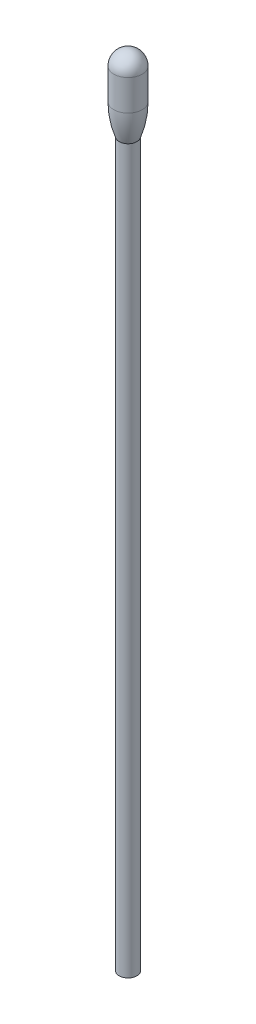
ISO-10303-21;
HEADER;
FILE_DESCRIPTION(('STEP AP214'),'2;1');
FILE_NAME('part.step','',(''),(''),'','','');
FILE_SCHEMA(('AUTOMOTIVE_DESIGN { 1 0 10303 214 1 1 1 1 }'));
ENDSEC;
DATA;
#1=APPLICATION_CONTEXT('core data for automotive mechanical design processes');
#2=APPLICATION_PROTOCOL_DEFINITION('international standard','automotive_design',2000,#1);
#3=PRODUCT_CONTEXT('',#1,'mechanical');
#4=PRODUCT('Part','Part','',(#3));
#5=PRODUCT_RELATED_PRODUCT_CATEGORY('part','',(#4));
#6=PRODUCT_DEFINITION_FORMATION('','',#4);
#7=PRODUCT_DEFINITION_CONTEXT('part definition',#1,'design');
#8=PRODUCT_DEFINITION('design','',#6,#7);
#9=PRODUCT_DEFINITION_SHAPE('','',#8);
#10=(LENGTH_UNIT() NAMED_UNIT(*) SI_UNIT(.MILLI.,.METRE.));
#11=(NAMED_UNIT(*) PLANE_ANGLE_UNIT() SI_UNIT($,.RADIAN.));
#12=(NAMED_UNIT(*) SI_UNIT($,.STERADIAN.) SOLID_ANGLE_UNIT());
#13=UNCERTAINTY_MEASURE_WITH_UNIT(LENGTH_MEASURE(1.E-05),#10,'distance_accuracy_value','');
#14=(GEOMETRIC_REPRESENTATION_CONTEXT(3) GLOBAL_UNCERTAINTY_ASSIGNED_CONTEXT((#13)) GLOBAL_UNIT_ASSIGNED_CONTEXT((#10,
#11,#12)) REPRESENTATION_CONTEXT('',''));
#15=CARTESIAN_POINT('',(0.,0.,0.));
#16=DIRECTION('',(0.,0.,1.));
#17=DIRECTION('',(1.,0.,0.));
#18=AXIS2_PLACEMENT_3D('',#15,#16,#17);
#19=CARTESIAN_POINT('',(0.,132.598365281621,0.));
#20=DIRECTION('',(0.,-1.,0.));
#21=DIRECTION('',(1.,0.,0.));
#22=AXIS2_PLACEMENT_3D('',#19,#20,#21);
#23=SPHERICAL_SURFACE('',#22,2.40163471837948);
#24=CARTESIAN_POINT('',(0.,132.598365281621,0.));
#25=DIRECTION('',(0.,-1.,0.));
#26=DIRECTION('',(0.,0.,-1.));
#27=AXIS2_PLACEMENT_3D('',#24,#25,#26);
#28=CIRCLE('',#27,2.40163471837948);
#29=CARTESIAN_POINT('',(0.,132.598365281621,-2.40163471837948));
#30=VERTEX_POINT('',#29);
#31=EDGE_CURVE('E10',#30,#30,#28,.T.);
#32=ORIENTED_EDGE('',*,*,#31,.F.);
#33=EDGE_LOOP('',(#32));
#34=FACE_BOUND('',#33,.T.);
#35=ADVANCED_FACE('F32',(#34),#23,.T.);
#36=CARTESIAN_POINT('',(0.,-0.0531704999708263,0.));
#37=DIRECTION('',(0.,-1.,0.));
#38=DIRECTION('',(0.,0.,-1.));
#39=AXIS2_PLACEMENT_3D('',#36,#37,#38);
#40=CYLINDRICAL_SURFACE('',#39,2.40163471837948);
#41=CARTESIAN_POINT('',(0.,127.386887787573,0.));
#42=DIRECTION('',(0.,-1.,0.));
#43=DIRECTION('',(0.,0.,-1.));
#44=AXIS2_PLACEMENT_3D('',#41,#42,#43);
#45=CIRCLE('',#44,2.40163471837948);
#46=CARTESIAN_POINT('',(0.,127.386887787573,-2.40163471837948));
#47=VERTEX_POINT('',#46);
#48=EDGE_CURVE('E38',#47,#47,#45,.T.);
#49=ORIENTED_EDGE('',*,*,#48,.F.);
#50=EDGE_LOOP('',(#49));
#51=FACE_BOUND('',#50,.T.);
#52=ORIENTED_EDGE('',*,*,#31,.T.);
#53=EDGE_LOOP('',(#52));
#54=FACE_BOUND('',#53,.T.);
#55=ADVANCED_FACE('F80',(#51,#54),#40,.T.);
#56=CARTESIAN_POINT('',(0.,127.386887787573,0.));
#57=DIRECTION('',(0.,-1.,0.));
#58=DIRECTION('',(0.,0.,-1.));
#59=AXIS2_PLACEMENT_3D('',#56,#57,#58);
#60=DEGENERATE_TOROIDAL_SURFACE('',#59,12.6565063886166,15.0581411069961,.F.);
#61=CARTESIAN_POINT('',(0.,122.254545196975,0.));
#62=DIRECTION('',(0.,-1.,0.));
#63=DIRECTION('',(0.,0.,-1.));
#64=AXIS2_PLACEMENT_3D('',#61,#62,#63);
#65=CIRCLE('',#64,1.5);
#66=CARTESIAN_POINT('',(0.,122.254545196975,-1.5));
#67=VERTEX_POINT('',#66);
#68=EDGE_CURVE('E42',#67,#67,#65,.T.);
#69=ORIENTED_EDGE('',*,*,#68,.F.);
#70=EDGE_LOOP('',(#69));
#71=FACE_BOUND('',#70,.T.);
#72=ORIENTED_EDGE('',*,*,#48,.T.);
#73=EDGE_LOOP('',(#72));
#74=FACE_BOUND('',#73,.T.);
#75=ADVANCED_FACE('F75',(#71,#74),#60,.F.);
#76=CARTESIAN_POINT('',(0.,-0.0531704999708263,0.));
#77=DIRECTION('',(0.,-1.,0.));
#78=DIRECTION('',(0.,0.,-1.));
#79=AXIS2_PLACEMENT_3D('',#76,#77,#78);
#80=CYLINDRICAL_SURFACE('',#79,1.5);
#81=CARTESIAN_POINT('',(0.,0.,0.));
#82=DIRECTION('',(0.,-1.,0.));
#83=DIRECTION('',(0.,0.,-1.));
#84=AXIS2_PLACEMENT_3D('',#81,#82,#83);
#85=CIRCLE('',#84,1.5);
#86=CARTESIAN_POINT('',(0.,0.,-1.5));
#87=VERTEX_POINT('',#86);
#88=EDGE_CURVE('E46',#87,#87,#85,.T.);
#89=ORIENTED_EDGE('',*,*,#88,.F.);
#90=EDGE_LOOP('',(#89));
#91=FACE_BOUND('',#90,.T.);
#92=ORIENTED_EDGE('',*,*,#68,.T.);
#93=EDGE_LOOP('',(#92));
#94=FACE_BOUND('',#93,.T.);
#95=ADVANCED_FACE('F69',(#91,#94),#80,.T.);
#96=CARTESIAN_POINT('',(-1.5,0.,0.));
#97=DIRECTION('',(0.,1.,0.));
#98=DIRECTION('',(0.,0.,1.));
#99=AXIS2_PLACEMENT_3D('',#96,#97,#98);
#100=PLANE('',#99);
#101=CARTESIAN_POINT('',(0.,0.,0.));
#102=DIRECTION('',(0.,-1.,0.));
#103=DIRECTION('',(0.,0.,-1.));
#104=AXIS2_PLACEMENT_3D('',#101,#102,#103);
#105=CIRCLE('',#104,0.625);
#106=CARTESIAN_POINT('',(0.,0.,-0.625));
#107=VERTEX_POINT('',#106);
#108=EDGE_CURVE('E51',#107,#107,#105,.T.);
#109=ORIENTED_EDGE('',*,*,#108,.F.);
#110=EDGE_LOOP('',(#109));
#111=FACE_BOUND('',#110,.T.);
#112=ORIENTED_EDGE('',*,*,#88,.T.);
#113=EDGE_LOOP('',(#112));
#114=FACE_BOUND('',#113,.T.);
#115=ADVANCED_FACE('F63',(#111,#114),#100,.F.);
#116=CARTESIAN_POINT('',(0.,-0.0531704999708263,0.));
#117=DIRECTION('',(0.,-1.,0.));
#118=DIRECTION('',(0.,0.,-1.));
#119=AXIS2_PLACEMENT_3D('',#116,#117,#118);
#120=CYLINDRICAL_SURFACE('',#119,0.625);
#121=CARTESIAN_POINT('',(0.,132.922166212137,0.));
#122=DIRECTION('',(0.,-1.,0.));
#123=DIRECTION('',(0.,0.,-1.));
#124=AXIS2_PLACEMENT_3D('',#121,#122,#123);
#125=CIRCLE('',#124,0.625);
#126=CARTESIAN_POINT('',(0.,132.922166212137,-0.625));
#127=VERTEX_POINT('',#126);
#128=EDGE_CURVE('E54',#127,#127,#125,.T.);
#129=ORIENTED_EDGE('',*,*,#128,.F.);
#130=EDGE_LOOP('',(#129));
#131=FACE_BOUND('',#130,.T.);
#132=ORIENTED_EDGE('',*,*,#108,.T.);
#133=EDGE_LOOP('',(#132));
#134=FACE_BOUND('',#133,.T.);
#135=ADVANCED_FACE('F60',(#131,#134),#120,.F.);
#136=CARTESIAN_POINT('',(-0.625,132.922166212137,0.));
#137=DIRECTION('',(0.,1.,0.));
#138=DIRECTION('',(0.,0.,1.));
#139=AXIS2_PLACEMENT_3D('',#136,#137,#138);
#140=PLANE('',#139);
#141=ORIENTED_EDGE('',*,*,#128,.T.);
#142=EDGE_LOOP('',(#141));
#143=FACE_BOUND('',#142,.T.);
#144=ADVANCED_FACE('F58',(#143),#140,.F.);
#145=CLOSED_SHELL('',(#35,#55,#75,#95,#115,#135,#144));
#146=MANIFOLD_SOLID_BREP('B2',#145);
#147=ADVANCED_BREP_SHAPE_REPRESENTATION('',(#18,#146),#14);
#148=SHAPE_DEFINITION_REPRESENTATION(#9,#147);
ENDSEC;
END-ISO-10303-21;
